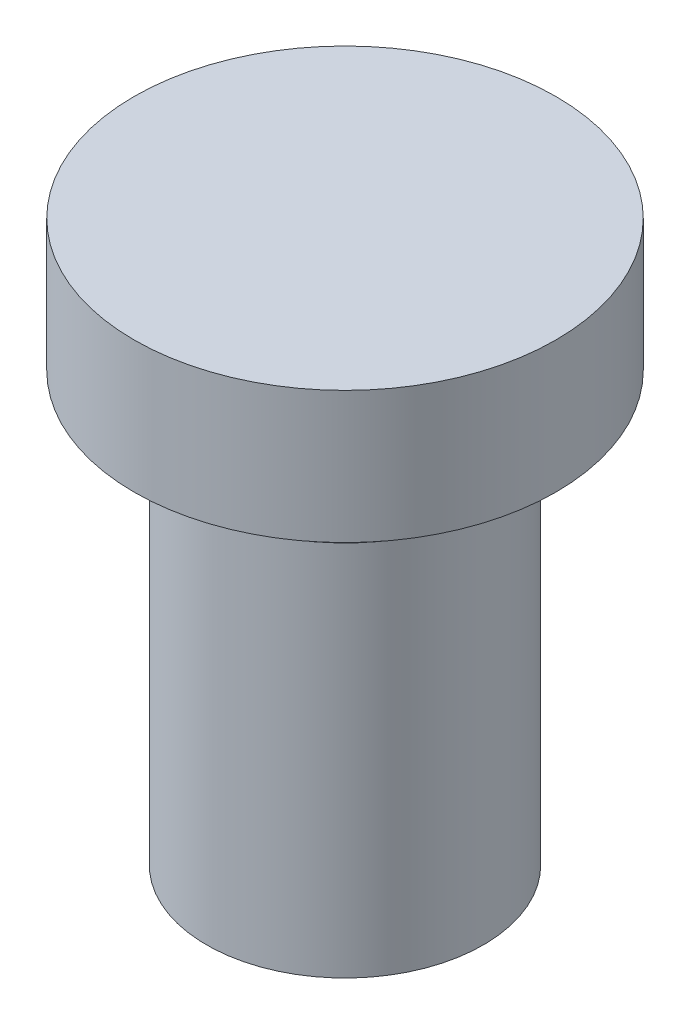
ISO-10303-21;
HEADER;
FILE_DESCRIPTION(('STEP AP214'),'2;1');
FILE_NAME('part.step','',(''),(''),'','','');
FILE_SCHEMA(('AUTOMOTIVE_DESIGN { 1 0 10303 214 1 1 1 1 }'));
ENDSEC;
DATA;
#1=APPLICATION_CONTEXT('core data for automotive mechanical design processes');
#2=APPLICATION_PROTOCOL_DEFINITION('international standard','automotive_design',2000,#1);
#3=PRODUCT_CONTEXT('',#1,'mechanical');
#4=PRODUCT('Part','Part','',(#3));
#5=PRODUCT_RELATED_PRODUCT_CATEGORY('part','',(#4));
#6=PRODUCT_DEFINITION_FORMATION('','',#4);
#7=PRODUCT_DEFINITION_CONTEXT('part definition',#1,'design');
#8=PRODUCT_DEFINITION('design','',#6,#7);
#9=PRODUCT_DEFINITION_SHAPE('','',#8);
#10=(LENGTH_UNIT() NAMED_UNIT(*) SI_UNIT(.MILLI.,.METRE.));
#11=(NAMED_UNIT(*) PLANE_ANGLE_UNIT() SI_UNIT($,.RADIAN.));
#12=(NAMED_UNIT(*) SI_UNIT($,.STERADIAN.) SOLID_ANGLE_UNIT());
#13=UNCERTAINTY_MEASURE_WITH_UNIT(LENGTH_MEASURE(1.E-05),#10,'distance_accuracy_value','');
#14=(GEOMETRIC_REPRESENTATION_CONTEXT(3) GLOBAL_UNCERTAINTY_ASSIGNED_CONTEXT((#13)) GLOBAL_UNIT_ASSIGNED_CONTEXT((#10,
#11,#12)) REPRESENTATION_CONTEXT('',''));
#15=CARTESIAN_POINT('',(0.,0.,0.));
#16=DIRECTION('',(0.,0.,1.));
#17=DIRECTION('',(1.,0.,0.));
#18=AXIS2_PLACEMENT_3D('',#15,#16,#17);
#19=CARTESIAN_POINT('',(1.05,0.,0.));
#20=DIRECTION('',(0.,-1.,0.));
#21=DIRECTION('',(0.,0.,-1.));
#22=AXIS2_PLACEMENT_3D('',#19,#20,#21);
#23=PLANE('',#22);
#24=CARTESIAN_POINT('',(0.,0.,0.));
#25=DIRECTION('',(0.,-1.,0.));
#26=DIRECTION('',(0.,0.,-1.));
#27=AXIS2_PLACEMENT_3D('',#24,#25,#26);
#28=CIRCLE('',#27,1.05);
#29=CARTESIAN_POINT('',(0.,0.,-1.05));
#30=VERTEX_POINT('',#29);
#31=EDGE_CURVE('E70',#30,#30,#28,.T.);
#32=ORIENTED_EDGE('',*,*,#31,.T.);
#33=EDGE_LOOP('',(#32));
#34=FACE_BOUND('',#33,.T.);
#35=ADVANCED_FACE('F43',(#34),#23,.T.);
#36=CARTESIAN_POINT('',(0.,4.25,0.));
#37=DIRECTION('',(0.,1.,0.));
#38=DIRECTION('',(0.,0.,1.));
#39=AXIS2_PLACEMENT_3D('',#36,#37,#38);
#40=PLANE('',#39);
#41=CARTESIAN_POINT('',(0.,4.25,0.));
#42=DIRECTION('',(0.,-1.,0.));
#43=DIRECTION('',(0.,0.,-1.));
#44=AXIS2_PLACEMENT_3D('',#41,#42,#43);
#45=CIRCLE('',#44,1.6);
#46=CARTESIAN_POINT('',(0.,4.25,-1.6));
#47=VERTEX_POINT('',#46);
#48=EDGE_CURVE('E10',#47,#47,#45,.T.);
#49=ORIENTED_EDGE('',*,*,#48,.F.);
#50=EDGE_LOOP('',(#49));
#51=FACE_BOUND('',#50,.T.);
#52=ADVANCED_FACE('F88',(#51),#40,.T.);
#53=CARTESIAN_POINT('',(0.,0.,0.));
#54=DIRECTION('',(0.,-1.,0.));
#55=DIRECTION('',(0.,0.,-1.));
#56=AXIS2_PLACEMENT_3D('',#53,#54,#55);
#57=CYLINDRICAL_SURFACE('',#56,1.6);
#58=ORIENTED_EDGE('',*,*,#48,.T.);
#59=EDGE_LOOP('',(#58));
#60=FACE_BOUND('',#59,.T.);
#61=CARTESIAN_POINT('',(0.,3.25,0.));
#62=DIRECTION('',(0.,-1.,0.));
#63=DIRECTION('',(0.,0.,-1.));
#64=AXIS2_PLACEMENT_3D('',#61,#62,#63);
#65=CIRCLE('',#64,1.6);
#66=CARTESIAN_POINT('',(0.,3.25,-1.6));
#67=VERTEX_POINT('',#66);
#68=EDGE_CURVE('E50',#67,#67,#65,.T.);
#69=ORIENTED_EDGE('',*,*,#68,.F.);
#70=EDGE_LOOP('',(#69));
#71=FACE_BOUND('',#70,.T.);
#72=ADVANCED_FACE('F92',(#60,#71),#57,.T.);
#73=CARTESIAN_POINT('',(1.25,3.25,0.));
#74=DIRECTION('',(0.,-1.,0.));
#75=DIRECTION('',(0.,0.,-1.));
#76=AXIS2_PLACEMENT_3D('',#73,#74,#75);
#77=PLANE('',#76);
#78=ORIENTED_EDGE('',*,*,#68,.T.);
#79=EDGE_LOOP('',(#78));
#80=FACE_BOUND('',#79,.T.);
#81=CARTESIAN_POINT('',(0.,3.25,0.));
#82=DIRECTION('',(0.,-1.,0.));
#83=DIRECTION('',(0.,0.,-1.));
#84=AXIS2_PLACEMENT_3D('',#81,#82,#83);
#85=CIRCLE('',#84,1.25);
#86=CARTESIAN_POINT('',(0.,3.25,-1.25));
#87=VERTEX_POINT('',#86);
#88=EDGE_CURVE('E55',#87,#87,#85,.T.);
#89=ORIENTED_EDGE('',*,*,#88,.F.);
#90=EDGE_LOOP('',(#89));
#91=FACE_BOUND('',#90,.T.);
#92=ADVANCED_FACE('F97',(#80,#91),#77,.T.);
#93=CARTESIAN_POINT('',(0.,0.,0.));
#94=DIRECTION('',(0.,-1.,0.));
#95=DIRECTION('',(0.,0.,-1.));
#96=AXIS2_PLACEMENT_3D('',#93,#94,#95);
#97=CYLINDRICAL_SURFACE('',#96,1.25);
#98=ORIENTED_EDGE('',*,*,#88,.T.);
#99=EDGE_LOOP('',(#98));
#100=FACE_BOUND('',#99,.T.);
#101=CARTESIAN_POINT('',(0.,3.,0.));
#102=DIRECTION('',(0.,-1.,0.));
#103=DIRECTION('',(0.,0.,-1.));
#104=AXIS2_PLACEMENT_3D('',#101,#102,#103);
#105=CIRCLE('',#104,1.25);
#106=CARTESIAN_POINT('',(0.,3.,-1.25));
#107=VERTEX_POINT('',#106);
#108=EDGE_CURVE('E60',#107,#107,#105,.T.);
#109=ORIENTED_EDGE('',*,*,#108,.F.);
#110=EDGE_LOOP('',(#109));
#111=FACE_BOUND('',#110,.T.);
#112=ADVANCED_FACE('F84',(#100,#111),#97,.T.);
#113=CARTESIAN_POINT('',(1.05,3.,0.));
#114=DIRECTION('',(0.,-1.,0.));
#115=DIRECTION('',(0.,0.,-1.));
#116=AXIS2_PLACEMENT_3D('',#113,#114,#115);
#117=PLANE('',#116);
#118=ORIENTED_EDGE('',*,*,#108,.T.);
#119=EDGE_LOOP('',(#118));
#120=FACE_BOUND('',#119,.T.);
#121=CARTESIAN_POINT('',(0.,3.,0.));
#122=DIRECTION('',(0.,-1.,0.));
#123=DIRECTION('',(0.,0.,-1.));
#124=AXIS2_PLACEMENT_3D('',#121,#122,#123);
#125=CIRCLE('',#124,1.05);
#126=CARTESIAN_POINT('',(0.,3.,-1.05));
#127=VERTEX_POINT('',#126);
#128=EDGE_CURVE('E66',#127,#127,#125,.T.);
#129=ORIENTED_EDGE('',*,*,#128,.F.);
#130=EDGE_LOOP('',(#129));
#131=FACE_BOUND('',#130,.T.);
#132=ADVANCED_FACE('F78',(#120,#131),#117,.T.);
#133=CARTESIAN_POINT('',(0.,0.,0.));
#134=DIRECTION('',(0.,-1.,0.));
#135=DIRECTION('',(0.,0.,-1.));
#136=AXIS2_PLACEMENT_3D('',#133,#134,#135);
#137=CYLINDRICAL_SURFACE('',#136,1.05);
#138=ORIENTED_EDGE('',*,*,#128,.T.);
#139=EDGE_LOOP('',(#138));
#140=FACE_BOUND('',#139,.T.);
#141=ORIENTED_EDGE('',*,*,#31,.F.);
#142=EDGE_LOOP('',(#141));
#143=FACE_BOUND('',#142,.T.);
#144=ADVANCED_FACE('F76',(#140,#143),#137,.T.);
#145=CLOSED_SHELL('',(#35,#52,#72,#92,#112,#132,#144));
#146=MANIFOLD_SOLID_BREP('B2',#145);
#147=ADVANCED_BREP_SHAPE_REPRESENTATION('',(#18,#146),#14);
#148=SHAPE_DEFINITION_REPRESENTATION(#9,#147);
ENDSEC;
END-ISO-10303-21;
